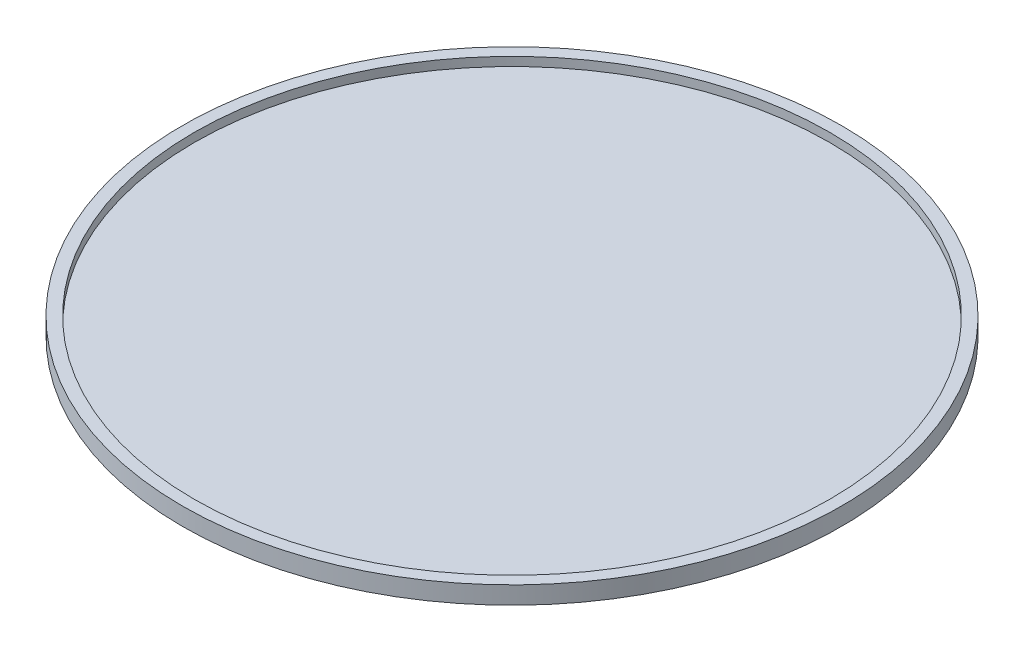
ISO-10303-21;
HEADER;
FILE_DESCRIPTION(('STEP AP214'),'2;1');
FILE_NAME('part.step','',(''),(''),'','','');
FILE_SCHEMA(('AUTOMOTIVE_DESIGN { 1 0 10303 214 1 1 1 1 }'));
ENDSEC;
DATA;
#1=APPLICATION_CONTEXT('core data for automotive mechanical design processes');
#2=APPLICATION_PROTOCOL_DEFINITION('international standard','automotive_design',2000,#1);
#3=PRODUCT_CONTEXT('',#1,'mechanical');
#4=PRODUCT('Part','Part','',(#3));
#5=PRODUCT_RELATED_PRODUCT_CATEGORY('part','',(#4));
#6=PRODUCT_DEFINITION_FORMATION('','',#4);
#7=PRODUCT_DEFINITION_CONTEXT('part definition',#1,'design');
#8=PRODUCT_DEFINITION('design','',#6,#7);
#9=PRODUCT_DEFINITION_SHAPE('','',#8);
#10=(LENGTH_UNIT() NAMED_UNIT(*) SI_UNIT(.MILLI.,.METRE.));
#11=(NAMED_UNIT(*) PLANE_ANGLE_UNIT() SI_UNIT($,.RADIAN.));
#12=(NAMED_UNIT(*) SI_UNIT($,.STERADIAN.) SOLID_ANGLE_UNIT());
#13=UNCERTAINTY_MEASURE_WITH_UNIT(LENGTH_MEASURE(1.E-05),#10,'distance_accuracy_value','');
#14=(GEOMETRIC_REPRESENTATION_CONTEXT(3) GLOBAL_UNCERTAINTY_ASSIGNED_CONTEXT((#13)) GLOBAL_UNIT_ASSIGNED_CONTEXT((#10,
#11,#12)) REPRESENTATION_CONTEXT('',''));
#15=CARTESIAN_POINT('',(0.,0.,0.));
#16=DIRECTION('',(0.,0.,1.));
#17=DIRECTION('',(1.,0.,0.));
#18=AXIS2_PLACEMENT_3D('',#15,#16,#17);
#19=CARTESIAN_POINT('',(0.,1.5,0.));
#20=DIRECTION('',(0.,-1.,0.));
#21=DIRECTION('',(0.,0.,-1.));
#22=AXIS2_PLACEMENT_3D('',#19,#20,#21);
#23=CYLINDRICAL_SURFACE('',#22,28.);
#24=CARTESIAN_POINT('',(0.,1.5,0.));
#25=DIRECTION('',(0.,1.,0.));
#26=DIRECTION('',(0.,0.,1.));
#27=AXIS2_PLACEMENT_3D('',#24,#25,#26);
#28=CIRCLE('',#27,28.);
#29=CARTESIAN_POINT('',(0.,1.5,28.));
#30=VERTEX_POINT('',#29);
#31=EDGE_CURVE('E10',#30,#30,#28,.T.);
#32=ORIENTED_EDGE('',*,*,#31,.F.);
#33=EDGE_LOOP('',(#32));
#34=FACE_BOUND('',#33,.T.);
#35=CARTESIAN_POINT('',(0.,0.,0.));
#36=DIRECTION('',(0.,1.,0.));
#37=DIRECTION('',(0.,0.,1.));
#38=AXIS2_PLACEMENT_3D('',#35,#36,#37);
#39=CIRCLE('',#38,28.);
#40=CARTESIAN_POINT('',(0.,0.,28.));
#41=VERTEX_POINT('',#40);
#42=EDGE_CURVE('E37',#41,#41,#39,.T.);
#43=ORIENTED_EDGE('',*,*,#42,.T.);
#44=EDGE_LOOP('',(#43));
#45=FACE_BOUND('',#44,.T.);
#46=ADVANCED_FACE('F34',(#34,#45),#23,.T.);
#47=CARTESIAN_POINT('',(0.,1.5,0.));
#48=DIRECTION('',(0.,1.,0.));
#49=DIRECTION('',(0.,0.,1.));
#50=AXIS2_PLACEMENT_3D('',#47,#48,#49);
#51=PLANE('',#50);
#52=CARTESIAN_POINT('',(0.,1.5,0.));
#53=DIRECTION('',(0.,1.,0.));
#54=DIRECTION('',(0.,0.,1.));
#55=AXIS2_PLACEMENT_3D('',#52,#53,#54);
#56=CIRCLE('',#55,27.);
#57=CARTESIAN_POINT('',(0.,1.5,27.));
#58=VERTEX_POINT('',#57);
#59=EDGE_CURVE('E46',#58,#58,#56,.T.);
#60=ORIENTED_EDGE('',*,*,#59,.F.);
#61=EDGE_LOOP('',(#60));
#62=FACE_BOUND('',#61,.T.);
#63=ORIENTED_EDGE('',*,*,#31,.T.);
#64=EDGE_LOOP('',(#63));
#65=FACE_BOUND('',#64,.T.);
#66=ADVANCED_FACE('F61',(#62,#65),#51,.T.);
#67=CARTESIAN_POINT('',(0.,0.,0.));
#68=DIRECTION('',(0.,1.,0.));
#69=DIRECTION('',(0.,0.,1.));
#70=AXIS2_PLACEMENT_3D('',#67,#68,#69);
#71=PLANE('',#70);
#72=ORIENTED_EDGE('',*,*,#42,.F.);
#73=EDGE_LOOP('',(#72));
#74=FACE_BOUND('',#73,.T.);
#75=ADVANCED_FACE('F57',(#74),#71,.F.);
#76=CARTESIAN_POINT('',(0.,0.75,0.));
#77=DIRECTION('',(0.,1.,0.));
#78=DIRECTION('',(0.,0.,1.));
#79=AXIS2_PLACEMENT_3D('',#76,#77,#78);
#80=CYLINDRICAL_SURFACE('',#79,27.);
#81=CARTESIAN_POINT('',(0.,0.75,0.));
#82=DIRECTION('',(0.,1.,0.));
#83=DIRECTION('',(0.,0.,1.));
#84=AXIS2_PLACEMENT_3D('',#81,#82,#83);
#85=CIRCLE('',#84,27.);
#86=CARTESIAN_POINT('',(0.,0.75,27.));
#87=VERTEX_POINT('',#86);
#88=EDGE_CURVE('E44',#87,#87,#85,.T.);
#89=ORIENTED_EDGE('',*,*,#88,.F.);
#90=EDGE_LOOP('',(#89));
#91=FACE_BOUND('',#90,.T.);
#92=ORIENTED_EDGE('',*,*,#59,.T.);
#93=EDGE_LOOP('',(#92));
#94=FACE_BOUND('',#93,.T.);
#95=ADVANCED_FACE('F54',(#91,#94),#80,.F.);
#96=CARTESIAN_POINT('',(0.,0.75,0.));
#97=DIRECTION('',(0.,1.,0.));
#98=DIRECTION('',(0.,0.,1.));
#99=AXIS2_PLACEMENT_3D('',#96,#97,#98);
#100=PLANE('',#99);
#101=ORIENTED_EDGE('',*,*,#88,.T.);
#102=EDGE_LOOP('',(#101));
#103=FACE_BOUND('',#102,.T.);
#104=ADVANCED_FACE('F52',(#103),#100,.T.);
#105=CLOSED_SHELL('',(#46,#66,#75,#95,#104));
#106=MANIFOLD_SOLID_BREP('B2',#105);
#107=ADVANCED_BREP_SHAPE_REPRESENTATION('',(#18,#106),#14);
#108=SHAPE_DEFINITION_REPRESENTATION(#9,#107);
ENDSEC;
END-ISO-10303-21;
